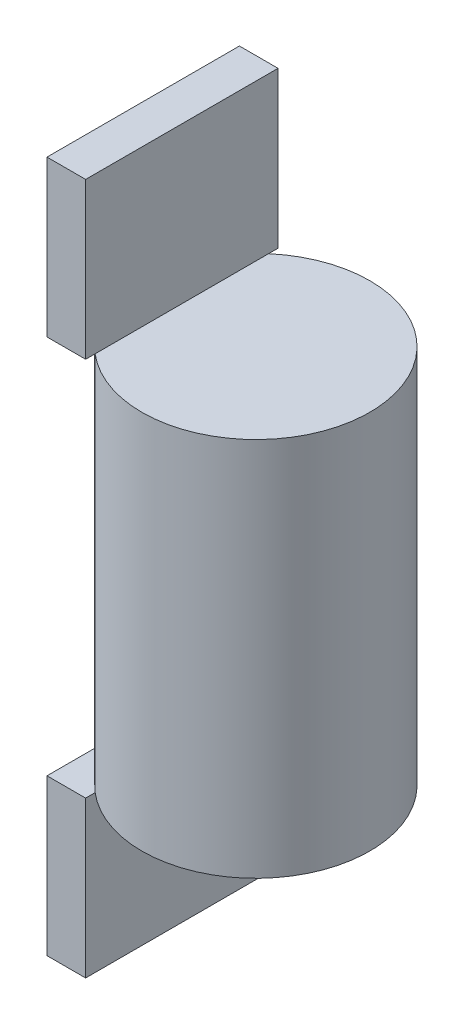
ISO-10303-21;
HEADER;
FILE_DESCRIPTION(('STEP AP214'),'2;1');
FILE_NAME('part.step','',(''),(''),'','','');
FILE_SCHEMA(('AUTOMOTIVE_DESIGN { 1 0 10303 214 1 1 1 1 }'));
ENDSEC;
DATA;
#1=APPLICATION_CONTEXT('core data for automotive mechanical design processes');
#2=APPLICATION_PROTOCOL_DEFINITION('international standard','automotive_design',2000,#1);
#3=PRODUCT_CONTEXT('',#1,'mechanical');
#4=PRODUCT('Part','Part','',(#3));
#5=PRODUCT_RELATED_PRODUCT_CATEGORY('part','',(#4));
#6=PRODUCT_DEFINITION_FORMATION('','',#4);
#7=PRODUCT_DEFINITION_CONTEXT('part definition',#1,'design');
#8=PRODUCT_DEFINITION('design','',#6,#7);
#9=PRODUCT_DEFINITION_SHAPE('','',#8);
#10=(LENGTH_UNIT() NAMED_UNIT(*) SI_UNIT(.MILLI.,.METRE.));
#11=(NAMED_UNIT(*) PLANE_ANGLE_UNIT() SI_UNIT($,.RADIAN.));
#12=(NAMED_UNIT(*) SI_UNIT($,.STERADIAN.) SOLID_ANGLE_UNIT());
#13=UNCERTAINTY_MEASURE_WITH_UNIT(LENGTH_MEASURE(1.E-05),#10,'distance_accuracy_value','');
#14=(GEOMETRIC_REPRESENTATION_CONTEXT(3) GLOBAL_UNCERTAINTY_ASSIGNED_CONTEXT((#13)) GLOBAL_UNIT_ASSIGNED_CONTEXT((#10,
#11,#12)) REPRESENTATION_CONTEXT('',''));
#15=CARTESIAN_POINT('',(0.,0.,0.));
#16=DIRECTION('',(0.,0.,1.));
#17=DIRECTION('',(1.,0.,0.));
#18=AXIS2_PLACEMENT_3D('',#15,#16,#17);
#19=CARTESIAN_POINT('',(0.,0.,0.));
#20=DIRECTION('',(0.,1.,0.));
#21=DIRECTION('',(0.,0.,1.));
#22=AXIS2_PLACEMENT_3D('',#19,#20,#21);
#23=PLANE('',#22);
#24=CARTESIAN_POINT('',(0.,0.,0.));
#25=DIRECTION('',(0.,1.,0.));
#26=DIRECTION('',(0.,0.,1.));
#27=AXIS2_PLACEMENT_3D('',#24,#25,#26);
#28=CIRCLE('',#27,3.);
#29=CARTESIAN_POINT('',(-2.9641113827744,0.,-0.462648582087114));
#30=VERTEX_POINT('',#29);
#31=CARTESIAN_POINT('',(-2.9641113827744,0.,0.462648582087114));
#32=VERTEX_POINT('',#31);
#33=EDGE_CURVE('E215',#30,#32,#28,.T.);
#34=ORIENTED_EDGE('',*,*,#33,.F.);
#35=DIRECTION('',(0.,0.,1.));
#36=VECTOR('',#35,1.);
#37=CARTESIAN_POINT('',(-2.9641113827744,0.,-2.53168134019457));
#38=LINE('',#37,#36);
#39=EDGE_CURVE('E11',#30,#32,#38,.T.);
#40=ORIENTED_EDGE('',*,*,#39,.T.);
#41=EDGE_LOOP('',(#34,#40));
#42=FACE_BOUND('',#41,.T.);
#43=ADVANCED_FACE('F35',(#42),#23,.F.);
#44=CARTESIAN_POINT('',(0.,10.,0.));
#45=DIRECTION('',(0.,1.,0.));
#46=DIRECTION('',(0.,0.,1.));
#47=AXIS2_PLACEMENT_3D('',#44,#45,#46);
#48=PLANE('',#47);
#49=DIRECTION('',(0.,0.,1.));
#50=VECTOR('',#49,1.);
#51=CARTESIAN_POINT('',(-2.9641113827744,10.,-2.53168134019457));
#52=LINE('',#51,#50);
#53=CARTESIAN_POINT('',(-2.9641113827744,10.,-0.462648582087114));
#54=VERTEX_POINT('',#53);
#55=CARTESIAN_POINT('',(-2.9641113827744,10.,0.462648582087114));
#56=VERTEX_POINT('',#55);
#57=EDGE_CURVE('E186',#54,#56,#52,.T.);
#58=ORIENTED_EDGE('',*,*,#57,.F.);
#59=CARTESIAN_POINT('',(0.,10.,0.));
#60=DIRECTION('',(0.,1.,0.));
#61=DIRECTION('',(0.,0.,1.));
#62=AXIS2_PLACEMENT_3D('',#59,#60,#61);
#63=CIRCLE('',#62,3.);
#64=EDGE_CURVE('E206',#54,#56,#63,.T.);
#65=ORIENTED_EDGE('',*,*,#64,.T.);
#66=EDGE_LOOP('',(#58,#65));
#67=FACE_BOUND('',#66,.T.);
#68=ADVANCED_FACE('F230',(#67),#48,.T.);
#69=CARTESIAN_POINT('',(0.,10.,0.));
#70=DIRECTION('',(0.,-1.,0.));
#71=DIRECTION('',(0.,0.,-1.));
#72=AXIS2_PLACEMENT_3D('',#69,#70,#71);
#73=CYLINDRICAL_SURFACE('',#72,3.);
#74=CARTESIAN_POINT('',(-1.94724558567761,10.,-2.28215569781272));
#75=VERTEX_POINT('',#74);
#76=EDGE_CURVE('E204',#75,#54,#63,.T.);
#77=ORIENTED_EDGE('',*,*,#76,.F.);
#78=CARTESIAN_POINT('',(-1.94724558567761,10.,2.28215569781272));
#79=VERTEX_POINT('',#78);
#80=EDGE_CURVE('E207',#79,#75,#63,.T.);
#81=ORIENTED_EDGE('',*,*,#80,.F.);
#82=EDGE_CURVE('E212',#56,#79,#63,.T.);
#83=ORIENTED_EDGE('',*,*,#82,.F.);
#84=ORIENTED_EDGE('',*,*,#64,.F.);
#85=EDGE_LOOP('',(#77,#81,#83,#84));
#86=FACE_BOUND('',#85,.T.);
#87=CARTESIAN_POINT('',(-1.94724558567761,0.,-2.28215569781272));
#88=VERTEX_POINT('',#87);
#89=EDGE_CURVE('E39',#88,#30,#28,.T.);
#90=ORIENTED_EDGE('',*,*,#89,.T.);
#91=ORIENTED_EDGE('',*,*,#33,.T.);
#92=CARTESIAN_POINT('',(-1.94724558567761,0.,2.28215569781272));
#93=VERTEX_POINT('',#92);
#94=EDGE_CURVE('E219',#32,#93,#28,.T.);
#95=ORIENTED_EDGE('',*,*,#94,.T.);
#96=EDGE_CURVE('E203',#93,#88,#28,.T.);
#97=ORIENTED_EDGE('',*,*,#96,.T.);
#98=EDGE_LOOP('',(#90,#91,#95,#97));
#99=FACE_BOUND('',#98,.T.);
#100=ADVANCED_FACE('F37',(#86,#99),#73,.T.);
#101=DIRECTION('',(0.,0.,-1.));
#102=VECTOR('',#101,1.);
#103=CARTESIAN_POINT('',(-1.94724558567761,10.,-2.53168134019457));
#104=LINE('',#103,#102);
#105=EDGE_CURVE('E61',#79,#75,#104,.T.);
#106=ORIENTED_EDGE('',*,*,#105,.F.);
#107=ORIENTED_EDGE('',*,*,#80,.T.);
#108=EDGE_LOOP('',(#106,#107));
#109=FACE_BOUND('',#108,.T.);
#110=ADVANCED_FACE('F237',(#109),#48,.T.);
#111=ORIENTED_EDGE('',*,*,#96,.F.);
#112=DIRECTION('',(0.,0.,-1.));
#113=VECTOR('',#112,1.);
#114=CARTESIAN_POINT('',(-1.94724558567761,0.,-2.53168134019457));
#115=LINE('',#114,#113);
#116=EDGE_CURVE('E44',#93,#88,#115,.T.);
#117=ORIENTED_EDGE('',*,*,#116,.T.);
#118=EDGE_LOOP('',(#111,#117));
#119=FACE_BOUND('',#118,.T.);
#120=ADVANCED_FACE('F231',(#119),#23,.F.);
#121=CARTESIAN_POINT('',(0.,10.,0.));
#122=DIRECTION('',(0.,-1.,0.));
#123=DIRECTION('',(0.,0.,-1.));
#124=AXIS2_PLACEMENT_3D('',#121,#122,#123);
#125=PLANE('',#124);
#126=CARTESIAN_POINT('',(-1.94724558567761,10.,-2.53168134019457));
#127=VERTEX_POINT('',#126);
#128=EDGE_CURVE('E188',#75,#127,#104,.T.);
#129=ORIENTED_EDGE('',*,*,#128,.F.);
#130=ORIENTED_EDGE('',*,*,#76,.T.);
#131=CARTESIAN_POINT('',(-2.9641113827744,10.,-2.53168134019457));
#132=VERTEX_POINT('',#131);
#133=EDGE_CURVE('E182',#132,#54,#52,.T.);
#134=ORIENTED_EDGE('',*,*,#133,.F.);
#135=DIRECTION('',(-1.,0.,0.));
#136=VECTOR('',#135,1.);
#137=CARTESIAN_POINT('',(-1.94724558567761,10.,-2.53168134019457));
#138=LINE('',#137,#136);
#139=EDGE_CURVE('E175',#127,#132,#138,.T.);
#140=ORIENTED_EDGE('',*,*,#139,.F.);
#141=EDGE_LOOP('',(#129,#130,#134,#140));
#142=FACE_BOUND('',#141,.T.);
#143=ADVANCED_FACE('F239',(#142),#125,.T.);
#144=CARTESIAN_POINT('',(-2.9641113827744,14.1,-2.53168134019457));
#145=DIRECTION('',(1.,0.,0.));
#146=DIRECTION('',(0.,0.,-1.));
#147=AXIS2_PLACEMENT_3D('',#144,#145,#146);
#148=PLANE('',#147);
#149=ORIENTED_EDGE('',*,*,#133,.T.);
#150=ORIENTED_EDGE('',*,*,#57,.T.);
#151=CARTESIAN_POINT('',(-2.9641113827744,10.,2.53168134019457));
#152=VERTEX_POINT('',#151);
#153=EDGE_CURVE('E140',#56,#152,#52,.T.);
#154=ORIENTED_EDGE('',*,*,#153,.T.);
#155=DIRECTION('',(0.,-1.,0.));
#156=VECTOR('',#155,1.);
#157=CARTESIAN_POINT('',(-2.9641113827744,14.1,2.53168134019457));
#158=LINE('',#157,#156);
#159=CARTESIAN_POINT('',(-2.9641113827744,14.1,2.53168134019457));
#160=VERTEX_POINT('',#159);
#161=EDGE_CURVE('E201',#160,#152,#158,.T.);
#162=ORIENTED_EDGE('',*,*,#161,.F.);
#163=DIRECTION('',(0.,0.,1.));
#164=VECTOR('',#163,1.);
#165=CARTESIAN_POINT('',(-2.9641113827744,14.1,-2.53168134019457));
#166=LINE('',#165,#164);
#167=CARTESIAN_POINT('',(-2.9641113827744,14.1,-2.53168134019457));
#168=VERTEX_POINT('',#167);
#169=EDGE_CURVE('E171',#168,#160,#166,.T.);
#170=ORIENTED_EDGE('',*,*,#169,.F.);
#171=DIRECTION('',(0.,-1.,0.));
#172=VECTOR('',#171,1.);
#173=CARTESIAN_POINT('',(-2.9641113827744,14.1,-2.53168134019457));
#174=LINE('',#173,#172);
#175=EDGE_CURVE('E181',#168,#132,#174,.T.);
#176=ORIENTED_EDGE('',*,*,#175,.T.);
#177=EDGE_LOOP('',(#149,#150,#154,#162,#170,#176));
#178=FACE_BOUND('',#177,.T.);
#179=ADVANCED_FACE('F245',(#178),#148,.F.);
#180=CARTESIAN_POINT('',(-1.94724558567761,14.1,2.53168134019457));
#181=DIRECTION('',(0.,0.,-1.));
#182=DIRECTION('',(-1.,0.,0.));
#183=AXIS2_PLACEMENT_3D('',#180,#181,#182);
#184=PLANE('',#183);
#185=DIRECTION('',(1.,0.,0.));
#186=VECTOR('',#185,1.);
#187=CARTESIAN_POINT('',(-1.94724558567761,10.,2.53168134019457));
#188=LINE('',#187,#186);
#189=CARTESIAN_POINT('',(-1.94724558567761,10.,2.53168134019457));
#190=VERTEX_POINT('',#189);
#191=EDGE_CURVE('E185',#152,#190,#188,.T.);
#192=ORIENTED_EDGE('',*,*,#191,.T.);
#193=DIRECTION('',(0.,-1.,0.));
#194=VECTOR('',#193,1.);
#195=CARTESIAN_POINT('',(-1.94724558567761,14.1,2.53168134019457));
#196=LINE('',#195,#194);
#197=CARTESIAN_POINT('',(-1.94724558567761,14.1,2.53168134019457));
#198=VERTEX_POINT('',#197);
#199=EDGE_CURVE('E198',#198,#190,#196,.T.);
#200=ORIENTED_EDGE('',*,*,#199,.F.);
#201=DIRECTION('',(1.,0.,0.));
#202=VECTOR('',#201,1.);
#203=CARTESIAN_POINT('',(-1.94724558567761,14.1,2.53168134019457));
#204=LINE('',#203,#202);
#205=EDGE_CURVE('E174',#160,#198,#204,.T.);
#206=ORIENTED_EDGE('',*,*,#205,.F.);
#207=ORIENTED_EDGE('',*,*,#161,.T.);
#208=EDGE_LOOP('',(#192,#200,#206,#207));
#209=FACE_BOUND('',#208,.T.);
#210=ADVANCED_FACE('F282',(#209),#184,.F.);
#211=CARTESIAN_POINT('',(-1.94724558567761,14.1,-2.53168134019457));
#212=DIRECTION('',(-1.,0.,0.));
#213=DIRECTION('',(0.,0.,1.));
#214=AXIS2_PLACEMENT_3D('',#211,#212,#213);
#215=PLANE('',#214);
#216=EDGE_CURVE('E189',#190,#79,#104,.T.);
#217=ORIENTED_EDGE('',*,*,#216,.T.);
#218=ORIENTED_EDGE('',*,*,#105,.T.);
#219=ORIENTED_EDGE('',*,*,#128,.T.);
#220=DIRECTION('',(0.,-1.,0.));
#221=VECTOR('',#220,1.);
#222=CARTESIAN_POINT('',(-1.94724558567761,14.1,-2.53168134019457));
#223=LINE('',#222,#221);
#224=CARTESIAN_POINT('',(-1.94724558567761,14.1,-2.53168134019457));
#225=VERTEX_POINT('',#224);
#226=EDGE_CURVE('E195',#225,#127,#223,.T.);
#227=ORIENTED_EDGE('',*,*,#226,.F.);
#228=DIRECTION('',(0.,0.,-1.));
#229=VECTOR('',#228,1.);
#230=CARTESIAN_POINT('',(-1.94724558567761,14.1,-2.53168134019457));
#231=LINE('',#230,#229);
#232=EDGE_CURVE('E177',#198,#225,#231,.T.);
#233=ORIENTED_EDGE('',*,*,#232,.F.);
#234=ORIENTED_EDGE('',*,*,#199,.T.);
#235=EDGE_LOOP('',(#217,#218,#219,#227,#233,#234));
#236=FACE_BOUND('',#235,.T.);
#237=ADVANCED_FACE('F278',(#236),#215,.F.);
#238=CARTESIAN_POINT('',(-1.94724558567761,14.1,-2.53168134019457));
#239=DIRECTION('',(0.,0.,1.));
#240=DIRECTION('',(1.,0.,0.));
#241=AXIS2_PLACEMENT_3D('',#238,#239,#240);
#242=PLANE('',#241);
#243=ORIENTED_EDGE('',*,*,#139,.T.);
#244=ORIENTED_EDGE('',*,*,#175,.F.);
#245=DIRECTION('',(-1.,0.,0.));
#246=VECTOR('',#245,1.);
#247=CARTESIAN_POINT('',(-1.94724558567761,14.1,-2.53168134019457));
#248=LINE('',#247,#246);
#249=EDGE_CURVE('E179',#225,#168,#248,.T.);
#250=ORIENTED_EDGE('',*,*,#249,.F.);
#251=ORIENTED_EDGE('',*,*,#226,.T.);
#252=EDGE_LOOP('',(#243,#244,#250,#251));
#253=FACE_BOUND('',#252,.T.);
#254=ADVANCED_FACE('F271',(#253),#242,.F.);
#255=CARTESIAN_POINT('',(0.,14.1,0.));
#256=DIRECTION('',(0.,-1.,0.));
#257=DIRECTION('',(0.,0.,-1.));
#258=AXIS2_PLACEMENT_3D('',#255,#256,#257);
#259=PLANE('',#258);
#260=ORIENTED_EDGE('',*,*,#169,.T.);
#261=ORIENTED_EDGE('',*,*,#205,.T.);
#262=ORIENTED_EDGE('',*,*,#232,.T.);
#263=ORIENTED_EDGE('',*,*,#249,.T.);
#264=EDGE_LOOP('',(#260,#261,#262,#263));
#265=FACE_BOUND('',#264,.T.);
#266=ADVANCED_FACE('F269',(#265),#259,.F.);
#267=ORIENTED_EDGE('',*,*,#153,.F.);
#268=ORIENTED_EDGE('',*,*,#82,.T.);
#269=ORIENTED_EDGE('',*,*,#216,.F.);
#270=ORIENTED_EDGE('',*,*,#191,.F.);
#271=EDGE_LOOP('',(#267,#268,#269,#270));
#272=FACE_BOUND('',#271,.T.);
#273=ADVANCED_FACE('F247',(#272),#125,.T.);
#274=CARTESIAN_POINT('',(0.,0.,0.));
#275=DIRECTION('',(0.,1.,0.));
#276=DIRECTION('',(0.,0.,-1.));
#277=AXIS2_PLACEMENT_3D('',#274,#275,#276);
#278=PLANE('',#277);
#279=ORIENTED_EDGE('',*,*,#89,.F.);
#280=CARTESIAN_POINT('',(-1.94724558567761,0.,-2.53168134019457));
#281=VERTEX_POINT('',#280);
#282=EDGE_CURVE('E54',#88,#281,#115,.T.);
#283=ORIENTED_EDGE('',*,*,#282,.T.);
#284=DIRECTION('',(-1.,0.,0.));
#285=VECTOR('',#284,1.);
#286=CARTESIAN_POINT('',(-1.94724558567761,0.,-2.53168134019457));
#287=LINE('',#286,#285);
#288=CARTESIAN_POINT('',(-2.9641113827744,0.,-2.53168134019457));
#289=VERTEX_POINT('',#288);
#290=EDGE_CURVE('E160',#281,#289,#287,.T.);
#291=ORIENTED_EDGE('',*,*,#290,.T.);
#292=EDGE_CURVE('E46',#289,#30,#38,.T.);
#293=ORIENTED_EDGE('',*,*,#292,.T.);
#294=EDGE_LOOP('',(#279,#283,#291,#293));
#295=FACE_BOUND('',#294,.T.);
#296=ADVANCED_FACE('F251',(#295),#278,.T.);
#297=ORIENTED_EDGE('',*,*,#94,.F.);
#298=CARTESIAN_POINT('',(-2.9641113827744,0.,2.53168134019457));
#299=VERTEX_POINT('',#298);
#300=EDGE_CURVE('E47',#32,#299,#38,.T.);
#301=ORIENTED_EDGE('',*,*,#300,.T.);
#302=DIRECTION('',(1.,0.,0.));
#303=VECTOR('',#302,1.);
#304=CARTESIAN_POINT('',(-1.94724558567761,0.,2.53168134019457));
#305=LINE('',#304,#303);
#306=CARTESIAN_POINT('',(-1.94724558567761,0.,2.53168134019457));
#307=VERTEX_POINT('',#306);
#308=EDGE_CURVE('E151',#299,#307,#305,.T.);
#309=ORIENTED_EDGE('',*,*,#308,.T.);
#310=EDGE_CURVE('E162',#307,#93,#115,.T.);
#311=ORIENTED_EDGE('',*,*,#310,.T.);
#312=EDGE_LOOP('',(#297,#301,#309,#311));
#313=FACE_BOUND('',#312,.T.);
#314=ADVANCED_FACE('F225',(#313),#278,.T.);
#315=CARTESIAN_POINT('',(-2.9641113827744,-4.1,-2.53168134019457));
#316=DIRECTION('',(-1.,0.,0.));
#317=DIRECTION('',(0.,0.,1.));
#318=AXIS2_PLACEMENT_3D('',#315,#316,#317);
#319=PLANE('',#318);
#320=ORIENTED_EDGE('',*,*,#292,.F.);
#321=DIRECTION('',(0.,1.,0.));
#322=VECTOR('',#321,1.);
#323=CARTESIAN_POINT('',(-2.9641113827744,-4.1,-2.53168134019457));
#324=LINE('',#323,#322);
#325=CARTESIAN_POINT('',(-2.9641113827744,-4.1,-2.53168134019457));
#326=VERTEX_POINT('',#325);
#327=EDGE_CURVE('E129',#326,#289,#324,.T.);
#328=ORIENTED_EDGE('',*,*,#327,.F.);
#329=DIRECTION('',(0.,0.,1.));
#330=VECTOR('',#329,1.);
#331=CARTESIAN_POINT('',(-2.9641113827744,-4.1,-2.53168134019457));
#332=LINE('',#331,#330);
#333=CARTESIAN_POINT('',(-2.9641113827744,-4.1,2.53168134019457));
#334=VERTEX_POINT('',#333);
#335=EDGE_CURVE('E133',#326,#334,#332,.T.);
#336=ORIENTED_EDGE('',*,*,#335,.T.);
#337=DIRECTION('',(0.,1.,0.));
#338=VECTOR('',#337,1.);
#339=CARTESIAN_POINT('',(-2.9641113827744,-4.1,2.53168134019457));
#340=LINE('',#339,#338);
#341=EDGE_CURVE('E158',#334,#299,#340,.T.);
#342=ORIENTED_EDGE('',*,*,#341,.T.);
#343=ORIENTED_EDGE('',*,*,#300,.F.);
#344=ORIENTED_EDGE('',*,*,#39,.F.);
#345=EDGE_LOOP('',(#320,#328,#336,#342,#343,#344));
#346=FACE_BOUND('',#345,.T.);
#347=ADVANCED_FACE('F131',(#346),#319,.T.);
#348=CARTESIAN_POINT('',(-1.94724558567761,-4.1,-2.53168134019457));
#349=DIRECTION('',(0.,0.,-1.));
#350=DIRECTION('',(-1.,0.,0.));
#351=AXIS2_PLACEMENT_3D('',#348,#349,#350);
#352=PLANE('',#351);
#353=ORIENTED_EDGE('',*,*,#290,.F.);
#354=DIRECTION('',(0.,1.,0.));
#355=VECTOR('',#354,1.);
#356=CARTESIAN_POINT('',(-1.94724558567761,-4.1,-2.53168134019457));
#357=LINE('',#356,#355);
#358=CARTESIAN_POINT('',(-1.94724558567761,-4.1,-2.53168134019457));
#359=VERTEX_POINT('',#358);
#360=EDGE_CURVE('E141',#359,#281,#357,.T.);
#361=ORIENTED_EDGE('',*,*,#360,.F.);
#362=DIRECTION('',(-1.,0.,0.));
#363=VECTOR('',#362,1.);
#364=CARTESIAN_POINT('',(-1.94724558567761,-4.1,-2.53168134019457));
#365=LINE('',#364,#363);
#366=EDGE_CURVE('E147',#359,#326,#365,.T.);
#367=ORIENTED_EDGE('',*,*,#366,.T.);
#368=ORIENTED_EDGE('',*,*,#327,.T.);
#369=EDGE_LOOP('',(#353,#361,#367,#368));
#370=FACE_BOUND('',#369,.T.);
#371=ADVANCED_FACE('F153',(#370),#352,.T.);
#372=CARTESIAN_POINT('',(-1.94724558567761,-4.1,-2.53168134019457));
#373=DIRECTION('',(1.,0.,0.));
#374=DIRECTION('',(0.,0.,-1.));
#375=AXIS2_PLACEMENT_3D('',#372,#373,#374);
#376=PLANE('',#375);
#377=ORIENTED_EDGE('',*,*,#310,.F.);
#378=DIRECTION('',(0.,1.,0.));
#379=VECTOR('',#378,1.);
#380=CARTESIAN_POINT('',(-1.94724558567761,-4.1,2.53168134019457));
#381=LINE('',#380,#379);
#382=CARTESIAN_POINT('',(-1.94724558567761,-4.1,2.53168134019457));
#383=VERTEX_POINT('',#382);
#384=EDGE_CURVE('E168',#383,#307,#381,.T.);
#385=ORIENTED_EDGE('',*,*,#384,.F.);
#386=DIRECTION('',(0.,0.,-1.));
#387=VECTOR('',#386,1.);
#388=CARTESIAN_POINT('',(-1.94724558567761,-4.1,-2.53168134019457));
#389=LINE('',#388,#387);
#390=EDGE_CURVE('E154',#383,#359,#389,.T.);
#391=ORIENTED_EDGE('',*,*,#390,.T.);
#392=ORIENTED_EDGE('',*,*,#360,.T.);
#393=ORIENTED_EDGE('',*,*,#282,.F.);
#394=ORIENTED_EDGE('',*,*,#116,.F.);
#395=EDGE_LOOP('',(#377,#385,#391,#392,#393,#394));
#396=FACE_BOUND('',#395,.T.);
#397=ADVANCED_FACE('F252',(#396),#376,.T.);
#398=CARTESIAN_POINT('',(-1.94724558567761,-4.1,2.53168134019457));
#399=DIRECTION('',(0.,0.,1.));
#400=DIRECTION('',(1.,0.,0.));
#401=AXIS2_PLACEMENT_3D('',#398,#399,#400);
#402=PLANE('',#401);
#403=ORIENTED_EDGE('',*,*,#308,.F.);
#404=ORIENTED_EDGE('',*,*,#341,.F.);
#405=DIRECTION('',(1.,0.,0.));
#406=VECTOR('',#405,1.);
#407=CARTESIAN_POINT('',(-1.94724558567761,-4.1,2.53168134019457));
#408=LINE('',#407,#406);
#409=EDGE_CURVE('E150',#334,#383,#408,.T.);
#410=ORIENTED_EDGE('',*,*,#409,.T.);
#411=ORIENTED_EDGE('',*,*,#384,.T.);
#412=EDGE_LOOP('',(#403,#404,#410,#411));
#413=FACE_BOUND('',#412,.T.);
#414=ADVANCED_FACE('F254',(#413),#402,.T.);
#415=CARTESIAN_POINT('',(0.,-4.1,0.));
#416=DIRECTION('',(0.,1.,0.));
#417=DIRECTION('',(0.,0.,-1.));
#418=AXIS2_PLACEMENT_3D('',#415,#416,#417);
#419=PLANE('',#418);
#420=ORIENTED_EDGE('',*,*,#335,.F.);
#421=ORIENTED_EDGE('',*,*,#366,.F.);
#422=ORIENTED_EDGE('',*,*,#390,.F.);
#423=ORIENTED_EDGE('',*,*,#409,.F.);
#424=EDGE_LOOP('',(#420,#421,#422,#423));
#425=FACE_BOUND('',#424,.T.);
#426=ADVANCED_FACE('F145',(#425),#419,.F.);
#427=CLOSED_SHELL('',(#43,#68,#100,#110,#120,#143,#179,#210,#237,#254,#266,#273,#296,#314,#347,
#371,#397,#414,#426));
#428=MANIFOLD_SOLID_BREP('B2',#427);
#429=ADVANCED_BREP_SHAPE_REPRESENTATION('',(#18,#428),#14);
#430=SHAPE_DEFINITION_REPRESENTATION(#9,#429);
ENDSEC;
END-ISO-10303-21;
